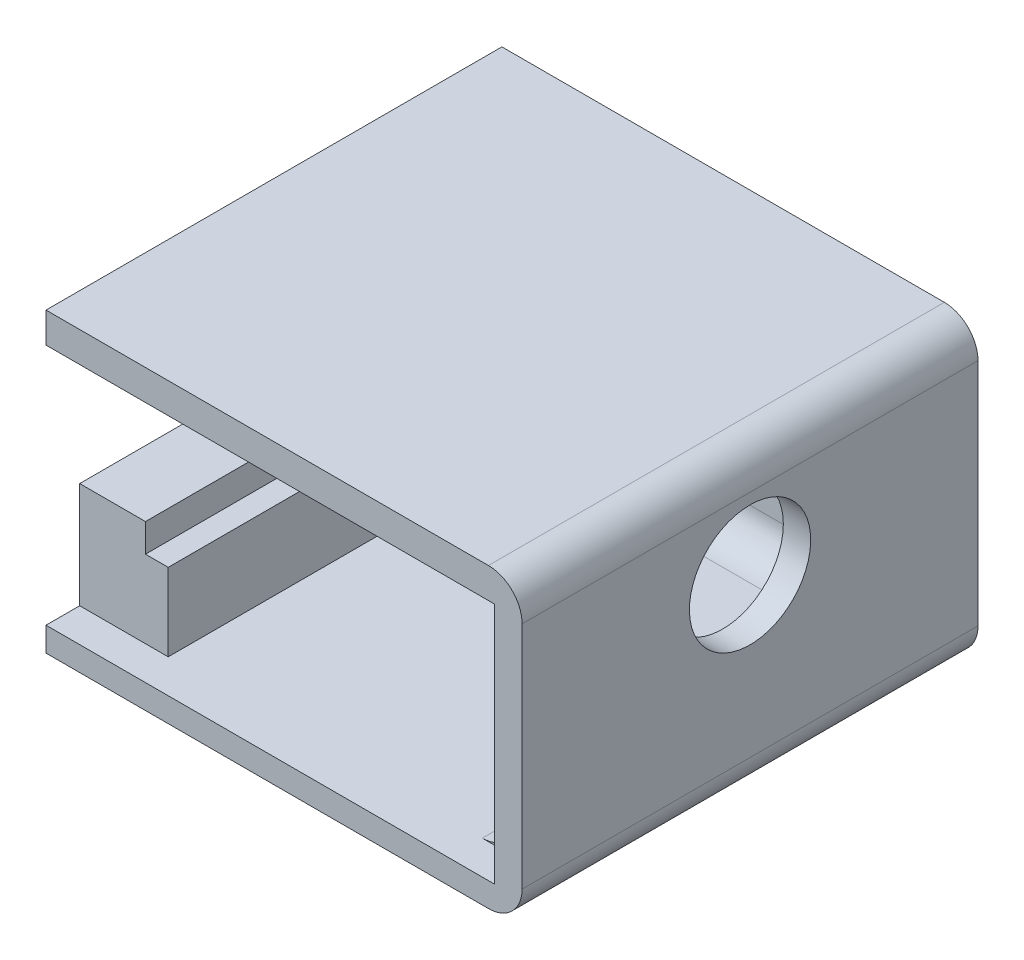
ISO-10303-21;
HEADER;
FILE_DESCRIPTION(('STEP AP214'),'2;1');
FILE_NAME('part.step','',(''),(''),'','','');
FILE_SCHEMA(('AUTOMOTIVE_DESIGN { 1 0 10303 214 1 1 1 1 }'));
ENDSEC;
DATA;
#1=APPLICATION_CONTEXT('core data for automotive mechanical design processes');
#2=APPLICATION_PROTOCOL_DEFINITION('international standard','automotive_design',2000,#1);
#3=PRODUCT_CONTEXT('',#1,'mechanical');
#4=PRODUCT('Part','Part','',(#3));
#5=PRODUCT_RELATED_PRODUCT_CATEGORY('part','',(#4));
#6=PRODUCT_DEFINITION_FORMATION('','',#4);
#7=PRODUCT_DEFINITION_CONTEXT('part definition',#1,'design');
#8=PRODUCT_DEFINITION('design','',#6,#7);
#9=PRODUCT_DEFINITION_SHAPE('','',#8);
#10=(LENGTH_UNIT() NAMED_UNIT(*) SI_UNIT(.MILLI.,.METRE.));
#11=(NAMED_UNIT(*) PLANE_ANGLE_UNIT() SI_UNIT($,.RADIAN.));
#12=(NAMED_UNIT(*) SI_UNIT($,.STERADIAN.) SOLID_ANGLE_UNIT());
#13=UNCERTAINTY_MEASURE_WITH_UNIT(LENGTH_MEASURE(1.E-05),#10,'distance_accuracy_value','');
#14=(GEOMETRIC_REPRESENTATION_CONTEXT(3) GLOBAL_UNCERTAINTY_ASSIGNED_CONTEXT((#13)) GLOBAL_UNIT_ASSIGNED_CONTEXT((#10,
#11,#12)) REPRESENTATION_CONTEXT('',''));
#15=CARTESIAN_POINT('',(0.,0.,0.));
#16=DIRECTION('',(0.,0.,1.));
#17=DIRECTION('',(1.,0.,0.));
#18=AXIS2_PLACEMENT_3D('',#15,#16,#17);
#19=CARTESIAN_POINT('',(-29.2123137237562,-14.8612171338496,-14.8829667343191));
#20=DIRECTION('',(0.,-1.,0.));
#21=DIRECTION('',(0.,0.,-1.));
#22=AXIS2_PLACEMENT_3D('',#19,#20,#21);
#23=PLANE('',#22);
#24=DIRECTION('',(1.,0.,0.));
#25=VECTOR('',#24,1.);
#26=CARTESIAN_POINT('',(-29.2123137237562,-14.8612171338496,-31.6029676477843));
#27=LINE('',#26,#25);
#28=CARTESIAN_POINT('',(-29.2123137237562,-14.8612171338496,-31.6029676477843));
#29=VERTEX_POINT('',#28);
#30=CARTESIAN_POINT('',(-26.2827516064484,-14.8612171338496,-31.6029676477843));
#31=VERTEX_POINT('',#30);
#32=EDGE_CURVE('E248',#29,#31,#27,.T.);
#33=ORIENTED_EDGE('',*,*,#32,.F.);
#34=DIRECTION('',(0.,0.,-1.));
#35=VECTOR('',#34,1.);
#36=CARTESIAN_POINT('',(-29.2123137237562,-14.8612171338496,-14.8829667343191));
#37=LINE('',#36,#35);
#38=CARTESIAN_POINT('',(-29.2123135264694,-14.8612171338496,-16.3829667343191));
#39=VERTEX_POINT('',#38);
#40=EDGE_CURVE('E357',#39,#29,#37,.T.);
#41=ORIENTED_EDGE('',*,*,#40,.F.);
#42=DIRECTION('',(-1.,0.,0.));
#43=VECTOR('',#42,1.);
#44=CARTESIAN_POINT('',(-29.2123137237562,-14.8612171338496,-16.3829667343191));
#45=LINE('',#44,#43);
#46=CARTESIAN_POINT('',(-26.2827516064484,-14.8612171338496,-16.3829667343191));
#47=VERTEX_POINT('',#46);
#48=EDGE_CURVE('E288',#47,#39,#45,.T.);
#49=ORIENTED_EDGE('',*,*,#48,.F.);
#50=DIRECTION('',(0.,0.,-1.));
#51=VECTOR('',#50,1.);
#52=CARTESIAN_POINT('',(-26.2827516064484,-14.8612171338496,-14.8829667343191));
#53=LINE('',#52,#51);
#54=EDGE_CURVE('E360',#47,#31,#53,.T.);
#55=ORIENTED_EDGE('',*,*,#54,.T.);
#56=EDGE_LOOP('',(#33,#41,#49,#55));
#57=FACE_BOUND('',#56,.T.);
#58=ADVANCED_FACE('F46',(#57),#23,.F.);
#59=CARTESIAN_POINT('',(-29.2123137237562,-8.77234834713554,-14.8829667343191));
#60=DIRECTION('',(0.,1.,0.));
#61=DIRECTION('',(0.,0.,1.));
#62=AXIS2_PLACEMENT_3D('',#59,#60,#61);
#63=PLANE('',#62);
#64=DIRECTION('',(0.,0.,-1.));
#65=VECTOR('',#64,1.);
#66=CARTESIAN_POINT('',(-23.9868864308807,-8.77234834713555,-31.6029676477843));
#67=LINE('',#66,#65);
#68=CARTESIAN_POINT('',(-23.9868864308807,-8.77234834713554,-31.6029676477843));
#69=VERTEX_POINT('',#68);
#70=CARTESIAN_POINT('',(-23.9868864308807,-8.77234834713555,-32.1829667343191));
#71=VERTEX_POINT('',#70);
#72=EDGE_CURVE('E261',#69,#71,#67,.T.);
#73=ORIENTED_EDGE('',*,*,#72,.T.);
#74=DIRECTION('',(-1.,0.,0.));
#75=VECTOR('',#74,1.);
#76=CARTESIAN_POINT('',(-15.7085447505018,-8.77234834713554,-32.1829667343191));
#77=LINE('',#76,#75);
#78=CARTESIAN_POINT('',(-15.7085447505018,-8.77234834713554,-32.1829667343191));
#79=VERTEX_POINT('',#78);
#80=EDGE_CURVE('E71',#71,#79,#77,.F.);
#81=ORIENTED_EDGE('',*,*,#80,.T.);
#82=DIRECTION('',(0.,0.,-1.));
#83=VECTOR('',#82,1.);
#84=CARTESIAN_POINT('',(-15.7085447505018,-8.77234834713554,-14.8829667343191));
#85=LINE('',#84,#83);
#86=CARTESIAN_POINT('',(-15.7085447505018,-8.77234834713556,-16.3829667343191));
#87=VERTEX_POINT('',#86);
#88=EDGE_CURVE('E381',#87,#79,#85,.T.);
#89=ORIENTED_EDGE('',*,*,#88,.F.);
#90=DIRECTION('',(-1.,0.,0.));
#91=VECTOR('',#90,1.);
#92=CARTESIAN_POINT('',(-29.2123135264694,-8.77234834713556,-16.3829667343191));
#93=LINE('',#92,#91);
#94=CARTESIAN_POINT('',(-9.23057385456345,-8.77234834713556,-16.3829667343191));
#95=VERTEX_POINT('',#94);
#96=EDGE_CURVE('E282',#95,#87,#93,.T.);
#97=ORIENTED_EDGE('',*,*,#96,.F.);
#98=DIRECTION('',(0.,0.,1.));
#99=VECTOR('',#98,1.);
#100=CARTESIAN_POINT('',(-9.23057385456345,-8.77234834713556,-16.3829667343191));
#101=LINE('',#100,#99);
#102=CARTESIAN_POINT('',(-9.23057385456345,-8.77234834713556,-14.8829667343191));
#103=VERTEX_POINT('',#102);
#104=EDGE_CURVE('E285',#95,#103,#101,.T.);
#105=ORIENTED_EDGE('',*,*,#104,.T.);
#106=DIRECTION('',(1.,0.,0.));
#107=VECTOR('',#106,1.);
#108=CARTESIAN_POINT('',(-29.2123137237562,-8.77234834713554,-14.8829667343191));
#109=LINE('',#108,#107);
#110=CARTESIAN_POINT('',(-29.2123137237562,-8.77234834713554,-14.8829667343191));
#111=VERTEX_POINT('',#110);
#112=EDGE_CURVE('E336',#111,#103,#109,.T.);
#113=ORIENTED_EDGE('',*,*,#112,.F.);
#114=DIRECTION('',(0.,0.,-1.));
#115=VECTOR('',#114,1.);
#116=CARTESIAN_POINT('',(-29.2123137237562,-8.77234834713554,-14.8829667343191));
#117=LINE('',#116,#115);
#118=CARTESIAN_POINT('',(-29.2123137237562,-8.77234834713554,-31.6029676477843));
#119=VERTEX_POINT('',#118);
#120=EDGE_CURVE('E383',#111,#119,#117,.T.);
#121=ORIENTED_EDGE('',*,*,#120,.T.);
#122=DIRECTION('',(-1.,0.,0.));
#123=VECTOR('',#122,1.);
#124=CARTESIAN_POINT('',(-29.2123137237562,-8.77234834713555,-31.6029676477843));
#125=LINE('',#124,#123);
#126=EDGE_CURVE('E264',#69,#119,#125,.T.);
#127=ORIENTED_EDGE('',*,*,#126,.F.);
#128=EDGE_LOOP('',(#73,#81,#89,#97,#105,#113,#121,#127));
#129=FACE_BOUND('',#128,.T.);
#130=ADVANCED_FACE('F529',(#129),#63,.F.);
#131=CARTESIAN_POINT('',(0.,0.,-33.6829667343191));
#132=DIRECTION('',(0.,0.,-1.));
#133=DIRECTION('',(-1.,0.,0.));
#134=AXIS2_PLACEMENT_3D('',#131,#132,#133);
#135=PLANE('',#134);
#136=DIRECTION('',(0.,1.,0.));
#137=VECTOR('',#136,1.);
#138=CARTESIAN_POINT('',(-15.7085447505018,-8.77234834713554,-33.6829667343191));
#139=LINE('',#138,#137);
#140=CARTESIAN_POINT('',(-15.7085447505018,-10.6850416503504,-33.6829667343191));
#141=VERTEX_POINT('',#140);
#142=CARTESIAN_POINT('',(-15.7085447505018,-10.2723483471355,-33.6829667343191));
#143=VERTEX_POINT('',#142);
#144=EDGE_CURVE('E319',#141,#143,#139,.T.);
#145=ORIENTED_EDGE('',*,*,#144,.T.);
#146=DIRECTION('',(-1.,0.,0.));
#147=VECTOR('',#146,1.);
#148=CARTESIAN_POINT('',(-23.9868864308807,-10.2723483471355,-33.6829667343191));
#149=LINE('',#148,#147);
#150=CARTESIAN_POINT('',(-23.9868864308807,-10.2723483471355,-33.6829667343191));
#151=VERTEX_POINT('',#150);
#152=EDGE_CURVE('E439',#143,#151,#149,.T.);
#153=ORIENTED_EDGE('',*,*,#152,.T.);
#154=DIRECTION('',(0.,1.,0.));
#155=VECTOR('',#154,1.);
#156=CARTESIAN_POINT('',(-23.9868864308807,-8.77234834713555,-33.6829667343191));
#157=LINE('',#156,#155);
#158=CARTESIAN_POINT('',(-23.9868864308807,-14.8612171338496,-33.6829667343191));
#159=VERTEX_POINT('',#158);
#160=EDGE_CURVE('E269',#159,#151,#157,.T.);
#161=ORIENTED_EDGE('',*,*,#160,.F.);
#162=DIRECTION('',(1.,0.,0.));
#163=VECTOR('',#162,1.);
#164=CARTESIAN_POINT('',(0.,-14.8612171338496,-33.6829667343191));
#165=LINE('',#164,#163);
#166=CARTESIAN_POINT('',(-26.2827516064484,-14.8612171338496,-33.6829667343191));
#167=VERTEX_POINT('',#166);
#168=EDGE_CURVE('E257',#167,#159,#165,.T.);
#169=ORIENTED_EDGE('',*,*,#168,.F.);
#170=DIRECTION('',(0.,-1.,0.));
#171=VECTOR('',#170,1.);
#172=CARTESIAN_POINT('',(-26.2827516064484,-14.8612171338496,-33.6829667343191));
#173=LINE('',#172,#171);
#174=CARTESIAN_POINT('',(-26.2827516064484,-16.1203527651684,-33.6829667343191));
#175=VERTEX_POINT('',#174);
#176=EDGE_CURVE('E310',#167,#175,#173,.T.);
#177=ORIENTED_EDGE('',*,*,#176,.T.);
#178=DIRECTION('',(1.,0.,0.));
#179=VECTOR('',#178,1.);
#180=CARTESIAN_POINT('',(-25.2701761684877,-16.1203527651684,-33.6829667343191));
#181=LINE('',#180,#179);
#182=CARTESIAN_POINT('',(-25.2701761684877,-16.1203527651684,-33.6829667343191));
#183=VERTEX_POINT('',#182);
#184=EDGE_CURVE('E313',#175,#183,#181,.T.);
#185=ORIENTED_EDGE('',*,*,#184,.T.);
#186=DIRECTION('',(0.,-1.,0.));
#187=VECTOR('',#186,1.);
#188=CARTESIAN_POINT('',(-25.2701761684877,-16.1203527651684,-33.6829667343191));
#189=LINE('',#188,#187);
#190=CARTESIAN_POINT('',(-25.2701761684877,-18.0725158209321,-33.6829667343191));
#191=VERTEX_POINT('',#190);
#192=EDGE_CURVE('E316',#183,#191,#189,.T.);
#193=ORIENTED_EDGE('',*,*,#192,.T.);
#194=DIRECTION('',(1.,0.,0.));
#195=VECTOR('',#194,1.);
#196=CARTESIAN_POINT('',(-11.2860781579052,-18.0725158209321,-33.6829667343191));
#197=LINE('',#196,#195);
#198=CARTESIAN_POINT('',(-11.2860781579052,-18.0725158209321,-33.6829667343191));
#199=VERTEX_POINT('',#198);
#200=EDGE_CURVE('E431',#191,#199,#197,.T.);
#201=ORIENTED_EDGE('',*,*,#200,.T.);
#202=DIRECTION('',(0.,-1.,0.));
#203=VECTOR('',#202,1.);
#204=CARTESIAN_POINT('',(-11.2860781579052,-17.6477380882893,-33.6829667343191));
#205=LINE('',#204,#203);
#206=CARTESIAN_POINT('',(-11.2860781579052,-17.6477380882893,-33.6829667343191));
#207=VERTEX_POINT('',#206);
#208=EDGE_CURVE('E433',#199,#207,#205,.F.);
#209=ORIENTED_EDGE('',*,*,#208,.T.);
#210=DIRECTION('',(1.,0.,0.));
#211=VECTOR('',#210,1.);
#212=CARTESIAN_POINT('',(-9.23057405185025,-17.6477380882893,-33.6829667343191));
#213=LINE('',#212,#211);
#214=CARTESIAN_POINT('',(-10.7305740518503,-17.6477380882893,-33.6829667343191));
#215=VERTEX_POINT('',#214);
#216=EDGE_CURVE('E436',#207,#215,#213,.T.);
#217=ORIENTED_EDGE('',*,*,#216,.T.);
#218=DIRECTION('',(0.,1.,0.));
#219=VECTOR('',#218,1.);
#220=CARTESIAN_POINT('',(-10.7305740518503,-9.18504165035041,-33.6829667343191));
#221=LINE('',#220,#219);
#222=CARTESIAN_POINT('',(-10.7305740518503,-10.6850416503504,-33.6829667343191));
#223=VERTEX_POINT('',#222);
#224=EDGE_CURVE('E414',#215,#223,#221,.T.);
#225=ORIENTED_EDGE('',*,*,#224,.T.);
#226=DIRECTION('',(-1.,0.,0.));
#227=VECTOR('',#226,1.);
#228=CARTESIAN_POINT('',(-15.7085447505018,-10.6850416503504,-33.6829667343191));
#229=LINE('',#228,#227);
#230=EDGE_CURVE('E411',#223,#141,#229,.T.);
#231=ORIENTED_EDGE('',*,*,#230,.T.);
#232=EDGE_LOOP('',(#145,#153,#161,#169,#177,#185,#193,#201,#209,#217,#225,#231));
#233=FACE_BOUND('',#232,.T.);
#234=ADVANCED_FACE('F467',(#233),#135,.F.);
#235=CARTESIAN_POINT('',(-15.7085447505018,-8.77234834713554,-14.8829667343191));
#236=DIRECTION('',(1.,0.,0.));
#237=DIRECTION('',(0.,0.,-1.));
#238=AXIS2_PLACEMENT_3D('',#235,#236,#237);
#239=PLANE('',#238);
#240=ORIENTED_EDGE('',*,*,#88,.T.);
#241=CARTESIAN_POINT('',(-15.7085447505018,-10.2723483471355,-32.1829667343191));
#242=DIRECTION('',(1.,0.,0.));
#243=DIRECTION('',(0.,0.,-1.));
#244=AXIS2_PLACEMENT_3D('',#241,#242,#243);
#245=CIRCLE('',#244,1.5);
#246=EDGE_CURVE('E447',#79,#143,#245,.F.);
#247=ORIENTED_EDGE('',*,*,#246,.T.);
#248=ORIENTED_EDGE('',*,*,#144,.F.);
#249=CARTESIAN_POINT('',(-15.7085447505018,-10.6850416503504,-32.1829667343191));
#250=DIRECTION('',(1.,0.,0.));
#251=DIRECTION('',(0.,0.,-1.));
#252=AXIS2_PLACEMENT_3D('',#249,#250,#251);
#253=CIRCLE('',#252,1.5);
#254=CARTESIAN_POINT('',(-15.7085447505018,-9.18504165035041,-32.1829667343191));
#255=VERTEX_POINT('',#254);
#256=EDGE_CURVE('E422',#141,#255,#253,.T.);
#257=ORIENTED_EDGE('',*,*,#256,.T.);
#258=DIRECTION('',(0.,0.,-1.));
#259=VECTOR('',#258,1.);
#260=CARTESIAN_POINT('',(-15.7085447505018,-9.18504165035041,-14.8829667343191));
#261=LINE('',#260,#259);
#262=CARTESIAN_POINT('',(-15.7085447505019,-9.18504165035041,-16.3829667343191));
#263=VERTEX_POINT('',#262);
#264=EDGE_CURVE('E378',#263,#255,#261,.T.);
#265=ORIENTED_EDGE('',*,*,#264,.F.);
#266=DIRECTION('',(0.,-1.,0.));
#267=VECTOR('',#266,1.);
#268=CARTESIAN_POINT('',(-15.7085447505018,-8.77234834713554,-16.3829667343191));
#269=LINE('',#268,#267);
#270=EDGE_CURVE('E308',#87,#263,#269,.T.);
#271=ORIENTED_EDGE('',*,*,#270,.F.);
#272=EDGE_LOOP('',(#240,#247,#248,#257,#265,#271));
#273=FACE_BOUND('',#272,.T.);
#274=ADVANCED_FACE('F561',(#273),#239,.F.);
#275=CARTESIAN_POINT('',(-9.23057405185025,-9.18504165035041,-14.8829667343191));
#276=DIRECTION('',(0.,1.,0.));
#277=DIRECTION('',(0.,0.,1.));
#278=AXIS2_PLACEMENT_3D('',#275,#276,#277);
#279=PLANE('',#278);
#280=ORIENTED_EDGE('',*,*,#264,.T.);
#281=DIRECTION('',(-1.,0.,0.));
#282=VECTOR('',#281,1.);
#283=CARTESIAN_POINT('',(-9.23057405185025,-9.18504165035041,-32.1829667343191));
#284=LINE('',#283,#282);
#285=CARTESIAN_POINT('',(-9.23057405185025,-9.18504165035041,-32.1829667343191));
#286=VERTEX_POINT('',#285);
#287=EDGE_CURVE('E420',#255,#286,#284,.F.);
#288=ORIENTED_EDGE('',*,*,#287,.T.);
#289=DIRECTION('',(0.,0.,-1.));
#290=VECTOR('',#289,1.);
#291=CARTESIAN_POINT('',(-9.23057405185025,-9.18504165035041,-14.8829667343191));
#292=LINE('',#291,#290);
#293=CARTESIAN_POINT('',(-9.23057385456345,-9.18504165035041,-16.3829667343191));
#294=VERTEX_POINT('',#293);
#295=EDGE_CURVE('E375',#294,#286,#292,.T.);
#296=ORIENTED_EDGE('',*,*,#295,.F.);
#297=DIRECTION('',(1.,0.,0.));
#298=VECTOR('',#297,1.);
#299=CARTESIAN_POINT('',(-9.23057405185025,-9.18504165035041,-16.3829667343191));
#300=LINE('',#299,#298);
#301=EDGE_CURVE('E306',#263,#294,#300,.T.);
#302=ORIENTED_EDGE('',*,*,#301,.F.);
#303=EDGE_LOOP('',(#280,#288,#296,#302));
#304=FACE_BOUND('',#303,.T.);
#305=ADVANCED_FACE('F555',(#304),#279,.F.);
#306=CARTESIAN_POINT('',(-9.23057405185025,-17.6477380882893,-14.8829667343191));
#307=DIRECTION('',(0.,-1.,0.));
#308=DIRECTION('',(0.,0.,-1.));
#309=AXIS2_PLACEMENT_3D('',#306,#307,#308);
#310=PLANE('',#309);
#311=DIRECTION('',(0.,0.,-1.));
#312=VECTOR('',#311,1.);
#313=CARTESIAN_POINT('',(-9.23057405185025,-17.6477380882893,-14.8829667343191));
#314=LINE('',#313,#312);
#315=CARTESIAN_POINT('',(-9.23057385456345,-17.6477380882893,-16.3829667343191));
#316=VERTEX_POINT('',#315);
#317=CARTESIAN_POINT('',(-9.23057405185025,-17.6477380882893,-32.1829667343191));
#318=VERTEX_POINT('',#317);
#319=EDGE_CURVE('E372',#316,#318,#314,.T.);
#320=ORIENTED_EDGE('',*,*,#319,.T.);
#321=CARTESIAN_POINT('',(-10.7305740518503,-17.6477380882893,-32.1829667343191));
#322=DIRECTION('',(0.,-1.,0.));
#323=DIRECTION('',(0.,0.,-1.));
#324=AXIS2_PLACEMENT_3D('',#321,#322,#323);
#325=CIRCLE('',#324,1.5);
#326=EDGE_CURVE('E418',#318,#215,#325,.F.);
#327=ORIENTED_EDGE('',*,*,#326,.T.);
#328=ORIENTED_EDGE('',*,*,#216,.F.);
#329=CARTESIAN_POINT('',(-11.2860781579052,-17.6477380882893,-32.1829667343191));
#330=DIRECTION('',(0.,-1.,0.));
#331=DIRECTION('',(0.,0.,-1.));
#332=AXIS2_PLACEMENT_3D('',#329,#330,#331);
#333=CIRCLE('',#332,1.5);
#334=CARTESIAN_POINT('',(-9.78607815790524,-17.6477380882893,-32.1829667343191));
#335=VERTEX_POINT('',#334);
#336=EDGE_CURVE('E11',#207,#335,#333,.T.);
#337=ORIENTED_EDGE('',*,*,#336,.T.);
#338=DIRECTION('',(0.,0.,-1.));
#339=VECTOR('',#338,1.);
#340=CARTESIAN_POINT('',(-9.78607815790524,-17.6477380882893,-14.8829667343191));
#341=LINE('',#340,#339);
#342=CARTESIAN_POINT('',(-9.78607815790524,-17.6477380882893,-16.3829667343191));
#343=VERTEX_POINT('',#342);
#344=EDGE_CURVE('E369',#343,#335,#341,.T.);
#345=ORIENTED_EDGE('',*,*,#344,.F.);
#346=DIRECTION('',(-1.,0.,0.));
#347=VECTOR('',#346,1.);
#348=CARTESIAN_POINT('',(-9.23057405185025,-17.6477380882893,-16.3829667343191));
#349=LINE('',#348,#347);
#350=EDGE_CURVE('E304',#316,#343,#349,.T.);
#351=ORIENTED_EDGE('',*,*,#350,.F.);
#352=EDGE_LOOP('',(#320,#327,#328,#337,#345,#351));
#353=FACE_BOUND('',#352,.T.);
#354=ADVANCED_FACE('F503',(#353),#310,.F.);
#355=CARTESIAN_POINT('',(-9.78607815790524,-17.6477380882893,-14.8829667343191));
#356=DIRECTION('',(1.,0.,0.));
#357=DIRECTION('',(0.,0.,-1.));
#358=AXIS2_PLACEMENT_3D('',#355,#356,#357);
#359=PLANE('',#358);
#360=ORIENTED_EDGE('',*,*,#344,.T.);
#361=DIRECTION('',(0.,-1.,0.));
#362=VECTOR('',#361,1.);
#363=CARTESIAN_POINT('',(-9.78607815790524,-18.0725158209321,-32.1829667343191));
#364=LINE('',#363,#362);
#365=CARTESIAN_POINT('',(-9.78607815790524,-18.0725158209321,-32.1829667343191));
#366=VERTEX_POINT('',#365);
#367=EDGE_CURVE('E424',#335,#366,#364,.T.);
#368=ORIENTED_EDGE('',*,*,#367,.T.);
#369=DIRECTION('',(0.,0.,-1.));
#370=VECTOR('',#369,1.);
#371=CARTESIAN_POINT('',(-9.78607815790524,-18.0725158209321,-16.3829667343191));
#372=LINE('',#371,#370);
#373=CARTESIAN_POINT('',(-9.78607815790524,-18.0725158209321,-16.3829667343191));
#374=VERTEX_POINT('',#373);
#375=EDGE_CURVE('E388',#366,#374,#372,.F.);
#376=ORIENTED_EDGE('',*,*,#375,.T.);
#377=DIRECTION('',(0.,-1.,0.));
#378=VECTOR('',#377,1.);
#379=CARTESIAN_POINT('',(-9.78607815790524,-17.6477380882893,-16.3829667343191));
#380=LINE('',#379,#378);
#381=EDGE_CURVE('E301',#343,#374,#380,.T.);
#382=ORIENTED_EDGE('',*,*,#381,.F.);
#383=EDGE_LOOP('',(#360,#368,#376,#382));
#384=FACE_BOUND('',#383,.T.);
#385=ADVANCED_FACE('F506',(#384),#359,.F.);
#386=CARTESIAN_POINT('',(-25.2701761684877,-16.1203527651684,-14.8829667343191));
#387=DIRECTION('',(-1.,0.,0.));
#388=DIRECTION('',(0.,0.,1.));
#389=AXIS2_PLACEMENT_3D('',#386,#387,#388);
#390=PLANE('',#389);
#391=DIRECTION('',(0.,0.,-1.));
#392=VECTOR('',#391,1.);
#393=CARTESIAN_POINT('',(-25.2701761684877,-19.5725158209321,-14.8829667343191));
#394=LINE('',#393,#392);
#395=CARTESIAN_POINT('',(-25.2701761684877,-19.5725158209321,-16.3829667343191));
#396=VERTEX_POINT('',#395);
#397=CARTESIAN_POINT('',(-25.2701761684877,-19.5725158209321,-32.1829667343191));
#398=VERTEX_POINT('',#397);
#399=EDGE_CURVE('E367',#396,#398,#394,.T.);
#400=ORIENTED_EDGE('',*,*,#399,.T.);
#401=CARTESIAN_POINT('',(-25.2701761684877,-18.0725158209321,-32.1829667343191));
#402=DIRECTION('',(-1.,0.,0.));
#403=DIRECTION('',(0.,0.,1.));
#404=AXIS2_PLACEMENT_3D('',#401,#402,#403);
#405=CIRCLE('',#404,1.5);
#406=EDGE_CURVE('E55',#398,#191,#405,.F.);
#407=ORIENTED_EDGE('',*,*,#406,.T.);
#408=ORIENTED_EDGE('',*,*,#192,.F.);
#409=DIRECTION('',(0.,0.,-1.));
#410=VECTOR('',#409,1.);
#411=CARTESIAN_POINT('',(-25.2701761684877,-16.1203527651684,-14.8829667343191));
#412=LINE('',#411,#410);
#413=CARTESIAN_POINT('',(-25.2701761684877,-16.1203527651684,-16.3829667343191));
#414=VERTEX_POINT('',#413);
#415=EDGE_CURVE('E365',#414,#183,#412,.T.);
#416=ORIENTED_EDGE('',*,*,#415,.F.);
#417=DIRECTION('',(0.,1.,0.));
#418=VECTOR('',#417,1.);
#419=CARTESIAN_POINT('',(-25.2701761684877,-16.1203527651684,-16.3829667343191));
#420=LINE('',#419,#418);
#421=EDGE_CURVE('E299',#396,#414,#420,.T.);
#422=ORIENTED_EDGE('',*,*,#421,.F.);
#423=EDGE_LOOP('',(#400,#407,#408,#416,#422));
#424=FACE_BOUND('',#423,.T.);
#425=ADVANCED_FACE('F473',(#424),#390,.F.);
#426=CARTESIAN_POINT('',(-25.2701761684877,-16.1203527651684,-14.8829667343191));
#427=DIRECTION('',(0.,-1.,0.));
#428=DIRECTION('',(0.,0.,-1.));
#429=AXIS2_PLACEMENT_3D('',#426,#427,#428);
#430=PLANE('',#429);
#431=DIRECTION('',(-1.,0.,0.));
#432=VECTOR('',#431,1.);
#433=CARTESIAN_POINT('',(-25.2701761684877,-16.1203527651684,-16.3829667343191));
#434=LINE('',#433,#432);
#435=CARTESIAN_POINT('',(-26.2827516064484,-16.1203527651684,-16.3829667343191));
#436=VERTEX_POINT('',#435);
#437=EDGE_CURVE('E297',#414,#436,#434,.T.);
#438=ORIENTED_EDGE('',*,*,#437,.F.);
#439=ORIENTED_EDGE('',*,*,#415,.T.);
#440=ORIENTED_EDGE('',*,*,#184,.F.);
#441=DIRECTION('',(0.,0.,-1.));
#442=VECTOR('',#441,1.);
#443=CARTESIAN_POINT('',(-26.2827516064484,-16.1203527651684,-14.8829667343191));
#444=LINE('',#443,#442);
#445=EDGE_CURVE('E363',#436,#175,#444,.T.);
#446=ORIENTED_EDGE('',*,*,#445,.F.);
#447=EDGE_LOOP('',(#438,#439,#440,#446));
#448=FACE_BOUND('',#447,.T.);
#449=ADVANCED_FACE('F542',(#448),#430,.F.);
#450=CARTESIAN_POINT('',(-26.2827516064484,-14.8612171338496,-14.8829667343191));
#451=DIRECTION('',(-1.,0.,0.));
#452=DIRECTION('',(0.,0.,1.));
#453=AXIS2_PLACEMENT_3D('',#450,#451,#452);
#454=PLANE('',#453);
#455=DIRECTION('',(0.,1.,0.));
#456=VECTOR('',#455,1.);
#457=CARTESIAN_POINT('',(-26.2827516064484,-14.8612171338496,-16.3829667343191));
#458=LINE('',#457,#456);
#459=EDGE_CURVE('E295',#436,#47,#458,.T.);
#460=ORIENTED_EDGE('',*,*,#459,.F.);
#461=ORIENTED_EDGE('',*,*,#445,.T.);
#462=ORIENTED_EDGE('',*,*,#176,.F.);
#463=DIRECTION('',(0.,0.,-1.));
#464=VECTOR('',#463,1.);
#465=CARTESIAN_POINT('',(-26.2827516064484,-14.8612171338496,-14.8829667343191));
#466=LINE('',#465,#464);
#467=EDGE_CURVE('E260',#31,#167,#466,.T.);
#468=ORIENTED_EDGE('',*,*,#467,.F.);
#469=ORIENTED_EDGE('',*,*,#54,.F.);
#470=EDGE_LOOP('',(#460,#461,#462,#468,#469));
#471=FACE_BOUND('',#470,.T.);
#472=ADVANCED_FACE('F539',(#471),#454,.F.);
#473=CARTESIAN_POINT('',(-9.23057405185025,-17.4004311571611,-14.8829667343191));
#474=DIRECTION('',(1.,0.,0.));
#475=DIRECTION('',(0.,0.,-1.));
#476=AXIS2_PLACEMENT_3D('',#473,#474,#475);
#477=PLANE('',#476);
#478=CARTESIAN_POINT('',(-9.23057405185025,-12.1074186089233,-25.0329667343191));
#479=DIRECTION('',(1.,0.,0.));
#480=DIRECTION('',(0.,0.,-1.));
#481=AXIS2_PLACEMENT_3D('',#478,#479,#480);
#482=CIRCLE('',#481,2.7);
#483=CARTESIAN_POINT('',(-9.23057405185025,-12.1074186089233,-27.7329667343191));
#484=VERTEX_POINT('',#483);
#485=EDGE_CURVE('E271',#484,#484,#482,.F.);
#486=ORIENTED_EDGE('',*,*,#485,.F.);
#487=EDGE_LOOP('',(#486));
#488=FACE_BOUND('',#487,.T.);
#489=ORIENTED_EDGE('',*,*,#295,.T.);
#490=DIRECTION('',(0.,1.,0.));
#491=VECTOR('',#490,1.);
#492=CARTESIAN_POINT('',(-9.23057405185025,-17.6477380882893,-32.1829667343191));
#493=LINE('',#492,#491);
#494=EDGE_CURVE('E416',#286,#318,#493,.F.);
#495=ORIENTED_EDGE('',*,*,#494,.T.);
#496=ORIENTED_EDGE('',*,*,#319,.F.);
#497=DIRECTION('',(0.,1.,0.));
#498=VECTOR('',#497,1.);
#499=CARTESIAN_POINT('',(-9.23057385456345,-8.77234834713556,-16.3829667343191));
#500=LINE('',#499,#498);
#501=CARTESIAN_POINT('',(-9.23057385456345,-19.5725158209321,-16.3829667343191));
#502=VERTEX_POINT('',#501);
#503=EDGE_CURVE('E280',#502,#316,#500,.T.);
#504=ORIENTED_EDGE('',*,*,#503,.F.);
#505=DIRECTION('',(0.,0.,1.));
#506=VECTOR('',#505,1.);
#507=CARTESIAN_POINT('',(-9.23057385456345,-19.5725158209321,-16.3829667343191));
#508=LINE('',#507,#506);
#509=CARTESIAN_POINT('',(-9.23057385456345,-19.5725158209321,-14.8829667343191));
#510=VERTEX_POINT('',#509);
#511=EDGE_CURVE('E289',#502,#510,#508,.T.);
#512=ORIENTED_EDGE('',*,*,#511,.T.);
#513=DIRECTION('',(0.,-1.,0.));
#514=VECTOR('',#513,1.);
#515=CARTESIAN_POINT('',(-9.23057405185025,-15.7089918171611,-14.8829667343191));
#516=LINE('',#515,#514);
#517=EDGE_CURVE('E338',#103,#510,#516,.T.);
#518=ORIENTED_EDGE('',*,*,#517,.F.);
#519=ORIENTED_EDGE('',*,*,#104,.F.);
#520=EDGE_CURVE('E279',#294,#95,#500,.T.);
#521=ORIENTED_EDGE('',*,*,#520,.F.);
#522=EDGE_LOOP('',(#489,#495,#496,#504,#512,#518,#519,#521));
#523=FACE_BOUND('',#522,.T.);
#524=ADVANCED_FACE('F494',(#488,#523),#477,.F.);
#525=CARTESIAN_POINT('',(-24.4209057708305,-19.5725158209321,-14.8829667343191));
#526=DIRECTION('',(0.,-1.,0.));
#527=DIRECTION('',(0.,0.,-1.));
#528=AXIS2_PLACEMENT_3D('',#525,#526,#527);
#529=PLANE('',#528);
#530=DIRECTION('',(0.,0.,-1.));
#531=VECTOR('',#530,1.);
#532=CARTESIAN_POINT('',(-11.2860781579052,-19.5725158209321,-33.6829667343191));
#533=LINE('',#532,#531);
#534=CARTESIAN_POINT('',(-11.2860781579052,-19.5725158209321,-16.3829667343191));
#535=VERTEX_POINT('',#534);
#536=CARTESIAN_POINT('',(-11.2860781579052,-19.5725158209321,-32.1829667343191));
#537=VERTEX_POINT('',#536);
#538=EDGE_CURVE('E386',#535,#537,#533,.T.);
#539=ORIENTED_EDGE('',*,*,#538,.T.);
#540=DIRECTION('',(1.,0.,0.));
#541=VECTOR('',#540,1.);
#542=CARTESIAN_POINT('',(-25.2701761684877,-19.5725158209321,-32.1829667343191));
#543=LINE('',#542,#541);
#544=EDGE_CURVE('E63',#537,#398,#543,.F.);
#545=ORIENTED_EDGE('',*,*,#544,.T.);
#546=ORIENTED_EDGE('',*,*,#399,.F.);
#547=DIRECTION('',(1.,0.,0.));
#548=VECTOR('',#547,1.);
#549=CARTESIAN_POINT('',(-29.2123135264694,-19.5725158209321,-16.3829667343191));
#550=LINE('',#549,#548);
#551=CARTESIAN_POINT('',(-29.2123135264694,-19.5725158209321,-16.3829667343191));
#552=VERTEX_POINT('',#551);
#553=EDGE_CURVE('E277',#552,#396,#550,.T.);
#554=ORIENTED_EDGE('',*,*,#553,.F.);
#555=DIRECTION('',(0.,0.,1.));
#556=VECTOR('',#555,1.);
#557=CARTESIAN_POINT('',(-29.2123135264694,-19.5725158209321,-16.3829667343191));
#558=LINE('',#557,#556);
#559=CARTESIAN_POINT('',(-29.2123137237562,-19.5725158209321,-14.8829667343191));
#560=VERTEX_POINT('',#559);
#561=EDGE_CURVE('E284',#552,#560,#558,.T.);
#562=ORIENTED_EDGE('',*,*,#561,.T.);
#563=DIRECTION('',(-1.,0.,0.));
#564=VECTOR('',#563,1.);
#565=CARTESIAN_POINT('',(-14.8037212227104,-19.5725158209321,-14.8829667343191));
#566=LINE('',#565,#564);
#567=EDGE_CURVE('E340',#510,#560,#566,.T.);
#568=ORIENTED_EDGE('',*,*,#567,.F.);
#569=ORIENTED_EDGE('',*,*,#511,.F.);
#570=EDGE_CURVE('E276',#535,#502,#550,.T.);
#571=ORIENTED_EDGE('',*,*,#570,.F.);
#572=EDGE_LOOP('',(#539,#545,#546,#554,#562,#568,#569,#571));
#573=FACE_BOUND('',#572,.T.);
#574=ADVANCED_FACE('F476',(#573),#529,.F.);
#575=CARTESIAN_POINT('',(-29.2123137237562,-20.6504303339754,-14.8829667343191));
#576=DIRECTION('',(1.,0.,0.));
#577=DIRECTION('',(0.,0.,-1.));
#578=AXIS2_PLACEMENT_3D('',#575,#576,#577);
#579=PLANE('',#578);
#580=DIRECTION('',(0.,-1.,0.));
#581=VECTOR('',#580,1.);
#582=CARTESIAN_POINT('',(-29.2123137237562,-20.6504303339754,-14.8829667343191));
#583=LINE('',#582,#581);
#584=CARTESIAN_POINT('',(-29.2123137237562,-20.6504303339754,-14.8829667343191));
#585=VERTEX_POINT('',#584);
#586=EDGE_CURVE('E342',#560,#585,#583,.T.);
#587=ORIENTED_EDGE('',*,*,#586,.F.);
#588=ORIENTED_EDGE('',*,*,#561,.F.);
#589=DIRECTION('',(0.,-1.,0.));
#590=VECTOR('',#589,1.);
#591=CARTESIAN_POINT('',(-29.2123135264694,-8.77234834713556,-16.3829667343191));
#592=LINE('',#591,#590);
#593=EDGE_CURVE('E274',#39,#552,#592,.T.);
#594=ORIENTED_EDGE('',*,*,#593,.F.);
#595=ORIENTED_EDGE('',*,*,#40,.T.);
#596=DIRECTION('',(0.,-1.,0.));
#597=VECTOR('',#596,1.);
#598=CARTESIAN_POINT('',(-29.2123137237562,-14.8612171338496,-31.6029676477843));
#599=LINE('',#598,#597);
#600=EDGE_CURVE('E251',#119,#29,#599,.T.);
#601=ORIENTED_EDGE('',*,*,#600,.F.);
#602=ORIENTED_EDGE('',*,*,#120,.F.);
#603=DIRECTION('',(0.,-1.,0.));
#604=VECTOR('',#603,1.);
#605=CARTESIAN_POINT('',(-29.2123137237562,-8.77234834713554,-14.8829667343191));
#606=LINE('',#605,#604);
#607=CARTESIAN_POINT('',(-29.2123137237562,-7.420991725931,-14.8829667343191));
#608=VERTEX_POINT('',#607);
#609=EDGE_CURVE('E333',#608,#111,#606,.T.);
#610=ORIENTED_EDGE('',*,*,#609,.F.);
#611=DIRECTION('',(0.,0.,-1.));
#612=VECTOR('',#611,1.);
#613=CARTESIAN_POINT('',(-29.2123137237562,-7.420991725931,-14.8829667343191));
#614=LINE('',#613,#612);
#615=CARTESIAN_POINT('',(-29.2123137237562,-7.420991725931,-35.1829667343191));
#616=VERTEX_POINT('',#615);
#617=EDGE_CURVE('E352',#608,#616,#614,.T.);
#618=ORIENTED_EDGE('',*,*,#617,.T.);
#619=DIRECTION('',(0.,-1.,0.));
#620=VECTOR('',#619,1.);
#621=CARTESIAN_POINT('',(-29.2123137237562,-8.77234834713554,-35.1829667343191));
#622=LINE('',#621,#620);
#623=CARTESIAN_POINT('',(-29.2123137237562,-20.6504303339754,-35.1829667343191));
#624=VERTEX_POINT('',#623);
#625=EDGE_CURVE('E322',#616,#624,#622,.T.);
#626=ORIENTED_EDGE('',*,*,#625,.T.);
#627=DIRECTION('',(0.,0.,-1.));
#628=VECTOR('',#627,1.);
#629=CARTESIAN_POINT('',(-29.2123137237562,-20.6504303339754,-14.8829667343191));
#630=LINE('',#629,#628);
#631=EDGE_CURVE('E355',#585,#624,#630,.T.);
#632=ORIENTED_EDGE('',*,*,#631,.F.);
#633=EDGE_LOOP('',(#587,#588,#594,#595,#601,#602,#610,#618,#626,#632));
#634=FACE_BOUND('',#633,.T.);
#635=ADVANCED_FACE('F483',(#634),#579,.F.);
#636=CARTESIAN_POINT('',(-8.01231335782909,-20.6504303339754,-14.8829667343191));
#637=DIRECTION('',(0.,1.,0.));
#638=DIRECTION('',(-1.,0.,0.));
#639=AXIS2_PLACEMENT_3D('',#636,#637,#638);
#640=PLANE('',#639);
#641=DIRECTION('',(1.,0.,0.));
#642=VECTOR('',#641,1.);
#643=CARTESIAN_POINT('',(-8.01231335782909,-20.6504303339754,-35.1829667343191));
#644=LINE('',#643,#642);
#645=CARTESIAN_POINT('',(-9.51231335782909,-20.6504303339754,-35.1829667343191));
#646=VERTEX_POINT('',#645);
#647=EDGE_CURVE('E325',#624,#646,#644,.T.);
#648=ORIENTED_EDGE('',*,*,#647,.T.);
#649=DIRECTION('',(0.,0.,-1.));
#650=VECTOR('',#649,1.);
#651=CARTESIAN_POINT('',(-9.51231335782909,-20.6504303339754,-14.8829667343191));
#652=LINE('',#651,#650);
#653=CARTESIAN_POINT('',(-9.51231335782909,-20.6504303339754,-14.8829667343191));
#654=VERTEX_POINT('',#653);
#655=EDGE_CURVE('E402',#646,#654,#652,.F.);
#656=ORIENTED_EDGE('',*,*,#655,.T.);
#657=DIRECTION('',(1.,0.,0.));
#658=VECTOR('',#657,1.);
#659=CARTESIAN_POINT('',(-8.01231335782909,-20.6504303339754,-14.8829667343191));
#660=LINE('',#659,#658);
#661=EDGE_CURVE('E344',#585,#654,#660,.T.);
#662=ORIENTED_EDGE('',*,*,#661,.F.);
#663=ORIENTED_EDGE('',*,*,#631,.T.);
#664=EDGE_LOOP('',(#648,#656,#662,#663));
#665=FACE_BOUND('',#664,.T.);
#666=ADVANCED_FACE('F589',(#665),#640,.F.);
#667=CARTESIAN_POINT('',(-8.0123133578291,-7.420991725931,-14.8829667343191));
#668=DIRECTION('',(-1.,0.,0.));
#669=DIRECTION('',(0.,-1.,0.));
#670=AXIS2_PLACEMENT_3D('',#667,#668,#669);
#671=PLANE('',#670);
#672=CARTESIAN_POINT('',(-8.0123133578291,-12.1074186089233,-25.0329667343191));
#673=DIRECTION('',(1.,0.,0.));
#674=DIRECTION('',(0.,1.,0.));
#675=AXIS2_PLACEMENT_3D('',#672,#673,#674);
#676=CIRCLE('',#675,2.7);
#677=CARTESIAN_POINT('',(-8.0123133578291,-9.40741860892329,-25.0329667343191));
#678=VERTEX_POINT('',#677);
#679=EDGE_CURVE('E428',#678,#678,#676,.T.);
#680=ORIENTED_EDGE('',*,*,#679,.F.);
#681=EDGE_LOOP('',(#680));
#682=FACE_BOUND('',#681,.T.);
#683=DIRECTION('',(0.,1.,0.));
#684=VECTOR('',#683,1.);
#685=CARTESIAN_POINT('',(-8.01231335782909,-19.6481079557216,-14.8829667343191));
#686=LINE('',#685,#684);
#687=CARTESIAN_POINT('',(-8.01231335782909,-19.1504303339754,-14.8829667343191));
#688=VERTEX_POINT('',#687);
#689=CARTESIAN_POINT('',(-8.01231335782909,-8.920991725931,-14.8829667343191));
#690=VERTEX_POINT('',#689);
#691=EDGE_CURVE('E347',#688,#690,#686,.T.);
#692=ORIENTED_EDGE('',*,*,#691,.F.);
#693=DIRECTION('',(0.,0.,-1.));
#694=VECTOR('',#693,1.);
#695=CARTESIAN_POINT('',(-8.01231335782909,-19.1504303339754,-14.8829667343191));
#696=LINE('',#695,#694);
#697=CARTESIAN_POINT('',(-8.01231335782909,-19.1504303339754,-35.1829667343191));
#698=VERTEX_POINT('',#697);
#699=EDGE_CURVE('E395',#688,#698,#696,.T.);
#700=ORIENTED_EDGE('',*,*,#699,.T.);
#701=DIRECTION('',(0.,1.,0.));
#702=VECTOR('',#701,1.);
#703=CARTESIAN_POINT('',(-8.01231335782909,-19.6481079557216,-35.1829667343191));
#704=LINE('',#703,#702);
#705=CARTESIAN_POINT('',(-8.01231335782909,-8.920991725931,-35.1829667343191));
#706=VERTEX_POINT('',#705);
#707=EDGE_CURVE('E328',#698,#706,#704,.T.);
#708=ORIENTED_EDGE('',*,*,#707,.T.);
#709=DIRECTION('',(0.,0.,-1.));
#710=VECTOR('',#709,1.);
#711=CARTESIAN_POINT('',(-8.0123133578291,-8.920991725931,-14.8829667343191));
#712=LINE('',#711,#710);
#713=EDGE_CURVE('E393',#706,#690,#712,.F.);
#714=ORIENTED_EDGE('',*,*,#713,.T.);
#715=EDGE_LOOP('',(#692,#700,#708,#714));
#716=FACE_BOUND('',#715,.T.);
#717=ADVANCED_FACE('F585',(#682,#716),#671,.F.);
#718=CARTESIAN_POINT('',(-29.2123137237562,-7.420991725931,-14.8829667343191));
#719=DIRECTION('',(0.,-1.,0.));
#720=DIRECTION('',(0.,0.,-1.));
#721=AXIS2_PLACEMENT_3D('',#718,#719,#720);
#722=PLANE('',#721);
#723=DIRECTION('',(-1.,0.,0.));
#724=VECTOR('',#723,1.);
#725=CARTESIAN_POINT('',(-9.51230942717903,-7.420991725931,-14.8829667343191));
#726=LINE('',#725,#724);
#727=CARTESIAN_POINT('',(-9.51231335782909,-7.420991725931,-14.8829667343191));
#728=VERTEX_POINT('',#727);
#729=EDGE_CURVE('E350',#728,#608,#726,.T.);
#730=ORIENTED_EDGE('',*,*,#729,.F.);
#731=DIRECTION('',(0.,0.,-1.));
#732=VECTOR('',#731,1.);
#733=CARTESIAN_POINT('',(-9.51231335782909,-7.420991725931,-14.8829667343191));
#734=LINE('',#733,#732);
#735=CARTESIAN_POINT('',(-9.51231335782909,-7.420991725931,-35.1829667343191));
#736=VERTEX_POINT('',#735);
#737=EDGE_CURVE('E408',#728,#736,#734,.T.);
#738=ORIENTED_EDGE('',*,*,#737,.T.);
#739=DIRECTION('',(-1.,0.,0.));
#740=VECTOR('',#739,1.);
#741=CARTESIAN_POINT('',(-9.51230942717903,-7.420991725931,-35.1829667343191));
#742=LINE('',#741,#740);
#743=EDGE_CURVE('E331',#736,#616,#742,.T.);
#744=ORIENTED_EDGE('',*,*,#743,.T.);
#745=ORIENTED_EDGE('',*,*,#617,.F.);
#746=EDGE_LOOP('',(#730,#738,#744,#745));
#747=FACE_BOUND('',#746,.T.);
#748=ADVANCED_FACE('F588',(#747),#722,.F.);
#749=CARTESIAN_POINT('',(0.,0.,-14.8829667343191));
#750=DIRECTION('',(0.,0.,-1.));
#751=DIRECTION('',(-1.,0.,0.));
#752=AXIS2_PLACEMENT_3D('',#749,#750,#751);
#753=PLANE('',#752);
#754=ORIENTED_EDGE('',*,*,#661,.T.);
#755=CARTESIAN_POINT('',(-9.51231335782909,-19.1504303339754,-14.8829667343191));
#756=DIRECTION('',(0.,0.,-1.));
#757=DIRECTION('',(-1.,0.,0.));
#758=AXIS2_PLACEMENT_3D('',#755,#756,#757);
#759=CIRCLE('',#758,1.5);
#760=EDGE_CURVE('E406',#654,#688,#759,.F.);
#761=ORIENTED_EDGE('',*,*,#760,.T.);
#762=ORIENTED_EDGE('',*,*,#691,.T.);
#763=CARTESIAN_POINT('',(-9.51231335782909,-8.920991725931,-14.8829667343191));
#764=DIRECTION('',(0.,0.,-1.));
#765=DIRECTION('',(-1.,0.,0.));
#766=AXIS2_PLACEMENT_3D('',#763,#764,#765);
#767=CIRCLE('',#766,1.5);
#768=EDGE_CURVE('E404',#690,#728,#767,.F.);
#769=ORIENTED_EDGE('',*,*,#768,.T.);
#770=ORIENTED_EDGE('',*,*,#729,.T.);
#771=ORIENTED_EDGE('',*,*,#609,.T.);
#772=ORIENTED_EDGE('',*,*,#112,.T.);
#773=ORIENTED_EDGE('',*,*,#517,.T.);
#774=ORIENTED_EDGE('',*,*,#567,.T.);
#775=ORIENTED_EDGE('',*,*,#586,.T.);
#776=EDGE_LOOP('',(#754,#761,#762,#769,#770,#771,#772,#773,#774,#775));
#777=FACE_BOUND('',#776,.T.);
#778=ADVANCED_FACE('F488',(#777),#753,.F.);
#779=CARTESIAN_POINT('',(0.,0.,-35.1829667343191));
#780=DIRECTION('',(0.,0.,-1.));
#781=DIRECTION('',(-1.,0.,0.));
#782=AXIS2_PLACEMENT_3D('',#779,#780,#781);
#783=PLANE('',#782);
#784=ORIENTED_EDGE('',*,*,#707,.F.);
#785=CARTESIAN_POINT('',(-9.51231335782909,-19.1504303339754,-35.1829667343191));
#786=DIRECTION('',(0.,0.,-1.));
#787=DIRECTION('',(-1.,0.,0.));
#788=AXIS2_PLACEMENT_3D('',#785,#786,#787);
#789=CIRCLE('',#788,1.5);
#790=EDGE_CURVE('E400',#698,#646,#789,.T.);
#791=ORIENTED_EDGE('',*,*,#790,.T.);
#792=ORIENTED_EDGE('',*,*,#647,.F.);
#793=ORIENTED_EDGE('',*,*,#625,.F.);
#794=ORIENTED_EDGE('',*,*,#743,.F.);
#795=CARTESIAN_POINT('',(-9.51231335782909,-8.920991725931,-35.1829667343191));
#796=DIRECTION('',(0.,0.,-1.));
#797=DIRECTION('',(-1.,0.,0.));
#798=AXIS2_PLACEMENT_3D('',#795,#796,#797);
#799=CIRCLE('',#798,1.5);
#800=EDGE_CURVE('E398',#736,#706,#799,.T.);
#801=ORIENTED_EDGE('',*,*,#800,.T.);
#802=EDGE_LOOP('',(#784,#791,#792,#793,#794,#801));
#803=FACE_BOUND('',#802,.T.);
#804=ADVANCED_FACE('F599',(#803),#783,.T.);
#805=CARTESIAN_POINT('',(0.,0.,-16.3829667343191));
#806=DIRECTION('',(0.,0.,1.));
#807=DIRECTION('',(1.,0.,0.));
#808=AXIS2_PLACEMENT_3D('',#805,#806,#807);
#809=PLANE('',#808);
#810=ORIENTED_EDGE('',*,*,#421,.T.);
#811=ORIENTED_EDGE('',*,*,#437,.T.);
#812=ORIENTED_EDGE('',*,*,#459,.T.);
#813=ORIENTED_EDGE('',*,*,#48,.T.);
#814=ORIENTED_EDGE('',*,*,#593,.T.);
#815=ORIENTED_EDGE('',*,*,#553,.T.);
#816=EDGE_LOOP('',(#810,#811,#812,#813,#814,#815));
#817=FACE_BOUND('',#816,.T.);
#818=ADVANCED_FACE('F741',(#817),#809,.T.);
#819=ORIENTED_EDGE('',*,*,#350,.T.);
#820=ORIENTED_EDGE('',*,*,#381,.T.);
#821=CARTESIAN_POINT('',(-11.2860781579052,-18.0725158209321,-16.3829667343191));
#822=DIRECTION('',(0.,0.,1.));
#823=DIRECTION('',(1.,0.,0.));
#824=AXIS2_PLACEMENT_3D('',#821,#822,#823);
#825=CIRCLE('',#824,1.5);
#826=EDGE_CURVE('E390',#374,#535,#825,.F.);
#827=ORIENTED_EDGE('',*,*,#826,.T.);
#828=ORIENTED_EDGE('',*,*,#570,.T.);
#829=ORIENTED_EDGE('',*,*,#503,.T.);
#830=EDGE_LOOP('',(#819,#820,#827,#828,#829));
#831=FACE_BOUND('',#830,.T.);
#832=ADVANCED_FACE('F499',(#831),#809,.T.);
#833=ORIENTED_EDGE('',*,*,#270,.T.);
#834=ORIENTED_EDGE('',*,*,#301,.T.);
#835=ORIENTED_EDGE('',*,*,#520,.T.);
#836=ORIENTED_EDGE('',*,*,#96,.T.);
#837=EDGE_LOOP('',(#833,#834,#835,#836));
#838=FACE_BOUND('',#837,.T.);
#839=ADVANCED_FACE('F708',(#838),#809,.T.);
#840=CARTESIAN_POINT('',(-29.2123137237562,-14.8612171338496,-31.6029676477843));
#841=DIRECTION('',(0.,1.,0.));
#842=DIRECTION('',(0.,0.,1.));
#843=AXIS2_PLACEMENT_3D('',#840,#841,#842);
#844=PLANE('',#843);
#845=CARTESIAN_POINT('',(-23.9868864308807,-14.8612171338496,-31.6029676477843));
#846=VERTEX_POINT('',#845);
#847=EDGE_CURVE('E240',#31,#846,#27,.T.);
#848=ORIENTED_EDGE('',*,*,#847,.F.);
#849=ORIENTED_EDGE('',*,*,#467,.T.);
#850=ORIENTED_EDGE('',*,*,#168,.T.);
#851=DIRECTION('',(0.,0.,-1.));
#852=VECTOR('',#851,1.);
#853=CARTESIAN_POINT('',(-23.9868864308807,-14.8612171338496,-31.6029676477843));
#854=LINE('',#853,#852);
#855=EDGE_CURVE('E255',#846,#159,#854,.T.);
#856=ORIENTED_EDGE('',*,*,#855,.F.);
#857=EDGE_LOOP('',(#848,#849,#850,#856));
#858=FACE_BOUND('',#857,.T.);
#859=ADVANCED_FACE('F256',(#858),#844,.F.);
#860=CARTESIAN_POINT('',(-23.9868864308807,-8.77234834713555,-31.6029676477843));
#861=DIRECTION('',(-1.,0.,0.));
#862=DIRECTION('',(0.,-1.,0.));
#863=AXIS2_PLACEMENT_3D('',#860,#861,#862);
#864=PLANE('',#863);
#865=ORIENTED_EDGE('',*,*,#160,.T.);
#866=CARTESIAN_POINT('',(-23.9868864308807,-10.2723483471355,-32.1829667343191));
#867=DIRECTION('',(-1.,0.,0.));
#868=DIRECTION('',(0.,-1.,0.));
#869=AXIS2_PLACEMENT_3D('',#866,#867,#868);
#870=CIRCLE('',#869,1.5);
#871=EDGE_CURVE('E444',#151,#71,#870,.F.);
#872=ORIENTED_EDGE('',*,*,#871,.T.);
#873=ORIENTED_EDGE('',*,*,#72,.F.);
#874=DIRECTION('',(0.,1.,0.));
#875=VECTOR('',#874,1.);
#876=CARTESIAN_POINT('',(-23.9868864308807,-8.77234834713555,-31.6029676477843));
#877=LINE('',#876,#875);
#878=EDGE_CURVE('E246',#846,#69,#877,.T.);
#879=ORIENTED_EDGE('',*,*,#878,.F.);
#880=ORIENTED_EDGE('',*,*,#855,.T.);
#881=EDGE_LOOP('',(#865,#872,#873,#879,#880));
#882=FACE_BOUND('',#881,.T.);
#883=ADVANCED_FACE('F263',(#882),#864,.F.);
#884=CARTESIAN_POINT('',(0.,0.,-31.6029676477843));
#885=DIRECTION('',(0.,0.,-1.));
#886=DIRECTION('',(-1.,0.,0.));
#887=AXIS2_PLACEMENT_3D('',#884,#885,#886);
#888=PLANE('',#887);
#889=ORIENTED_EDGE('',*,*,#600,.T.);
#890=ORIENTED_EDGE('',*,*,#32,.T.);
#891=ORIENTED_EDGE('',*,*,#847,.T.);
#892=ORIENTED_EDGE('',*,*,#878,.T.);
#893=ORIENTED_EDGE('',*,*,#126,.T.);
#894=EDGE_LOOP('',(#889,#890,#891,#892,#893));
#895=FACE_BOUND('',#894,.T.);
#896=ADVANCED_FACE('F243',(#895),#888,.F.);
#897=CARTESIAN_POINT('',(-29.2133137237562,-12.1074186089233,-25.0329667343191));
#898=DIRECTION('',(1.,0.,0.));
#899=DIRECTION('',(0.,1.,0.));
#900=AXIS2_PLACEMENT_3D('',#897,#898,#899);
#901=CYLINDRICAL_SURFACE('',#900,2.7);
#902=ORIENTED_EDGE('',*,*,#679,.T.);
#903=EDGE_LOOP('',(#902));
#904=FACE_BOUND('',#903,.T.);
#905=ORIENTED_EDGE('',*,*,#485,.T.);
#906=EDGE_LOOP('',(#905));
#907=FACE_BOUND('',#906,.T.);
#908=ADVANCED_FACE('F514',(#904,#907),#901,.F.);
#909=CARTESIAN_POINT('',(-11.2860781579052,-18.0725158209321,-14.8829667343191));
#910=DIRECTION('',(0.,0.,1.));
#911=DIRECTION('',(1.,0.,0.));
#912=AXIS2_PLACEMENT_3D('',#909,#910,#911);
#913=CYLINDRICAL_SURFACE('',#912,1.5);
#914=ORIENTED_EDGE('',*,*,#375,.F.);
#915=CARTESIAN_POINT('',(-11.2860781579052,-18.0725158209321,-32.1829667343191));
#916=DIRECTION('',(0.,0.,1.));
#917=DIRECTION('',(1.,0.,0.));
#918=AXIS2_PLACEMENT_3D('',#915,#916,#917);
#919=CIRCLE('',#918,1.5);
#920=EDGE_CURVE('E442',#366,#537,#919,.F.);
#921=ORIENTED_EDGE('',*,*,#920,.T.);
#922=ORIENTED_EDGE('',*,*,#538,.F.);
#923=ORIENTED_EDGE('',*,*,#826,.F.);
#924=EDGE_LOOP('',(#914,#921,#922,#923));
#925=FACE_BOUND('',#924,.T.);
#926=ADVANCED_FACE('F511',(#925),#913,.F.);
#927=CARTESIAN_POINT('',(-9.51231335782909,-19.1504303339754,-14.8829667343191));
#928=DIRECTION('',(0.,0.,-1.));
#929=DIRECTION('',(-1.,0.,0.));
#930=AXIS2_PLACEMENT_3D('',#927,#928,#929);
#931=CYLINDRICAL_SURFACE('',#930,1.5);
#932=ORIENTED_EDGE('',*,*,#760,.F.);
#933=ORIENTED_EDGE('',*,*,#655,.F.);
#934=ORIENTED_EDGE('',*,*,#790,.F.);
#935=ORIENTED_EDGE('',*,*,#699,.F.);
#936=EDGE_LOOP('',(#932,#933,#934,#935));
#937=FACE_BOUND('',#936,.T.);
#938=ADVANCED_FACE('F513',(#937),#931,.T.);
#939=CARTESIAN_POINT('',(-9.51231335782909,-8.920991725931,-14.8829667343191));
#940=DIRECTION('',(0.,0.,-1.));
#941=DIRECTION('',(-1.,0.,0.));
#942=AXIS2_PLACEMENT_3D('',#939,#940,#941);
#943=CYLINDRICAL_SURFACE('',#942,1.5);
#944=ORIENTED_EDGE('',*,*,#768,.F.);
#945=ORIENTED_EDGE('',*,*,#713,.F.);
#946=ORIENTED_EDGE('',*,*,#800,.F.);
#947=ORIENTED_EDGE('',*,*,#737,.F.);
#948=EDGE_LOOP('',(#944,#945,#946,#947));
#949=FACE_BOUND('',#948,.T.);
#950=ADVANCED_FACE('F521',(#949),#943,.T.);
#951=CARTESIAN_POINT('',(0.,-10.6850416503504,-32.1829667343191));
#952=DIRECTION('',(1.,0.,0.));
#953=DIRECTION('',(0.,0.,-1.));
#954=AXIS2_PLACEMENT_3D('',#951,#952,#953);
#955=CYLINDRICAL_SURFACE('',#954,1.5);
#956=ORIENTED_EDGE('',*,*,#256,.F.);
#957=ORIENTED_EDGE('',*,*,#230,.F.);
#958=CARTESIAN_POINT('',(-10.7305740518503,-10.6850416503504,-32.1829667343191));
#959=DIRECTION('',(0.707106781186547,-0.707106781186547,0.));
#960=DIRECTION('',(-0.707106781186547,-0.707106781186547,0.));
#961=AXIS2_PLACEMENT_3D('',#958,#959,#960);
#962=ELLIPSE('',#961,2.12132034355964,1.5);
#963=EDGE_CURVE('E425',#286,#223,#962,.F.);
#964=ORIENTED_EDGE('',*,*,#963,.F.);
#965=ORIENTED_EDGE('',*,*,#287,.F.);
#966=EDGE_LOOP('',(#956,#957,#964,#965));
#967=FACE_BOUND('',#966,.T.);
#968=ADVANCED_FACE('F617',(#967),#955,.F.);
#969=CARTESIAN_POINT('',(-10.7305740518503,0.,-32.1829667343191));
#970=DIRECTION('',(0.,-1.,0.));
#971=DIRECTION('',(0.,0.,-1.));
#972=AXIS2_PLACEMENT_3D('',#969,#970,#971);
#973=CYLINDRICAL_SURFACE('',#972,1.5);
#974=ORIENTED_EDGE('',*,*,#224,.F.);
#975=ORIENTED_EDGE('',*,*,#326,.F.);
#976=ORIENTED_EDGE('',*,*,#494,.F.);
#977=ORIENTED_EDGE('',*,*,#963,.T.);
#978=EDGE_LOOP('',(#974,#975,#976,#977));
#979=FACE_BOUND('',#978,.T.);
#980=ADVANCED_FACE('F620',(#979),#973,.F.);
#981=CARTESIAN_POINT('',(0.,-18.0725158209321,-32.1829667343191));
#982=DIRECTION('',(-1.,0.,0.));
#983=DIRECTION('',(0.,0.,1.));
#984=AXIS2_PLACEMENT_3D('',#981,#982,#983);
#985=CYLINDRICAL_SURFACE('',#984,1.5);
#986=ORIENTED_EDGE('',*,*,#406,.F.);
#987=ORIENTED_EDGE('',*,*,#544,.F.);
#988=CARTESIAN_POINT('',(-11.2860781579052,-18.0725158209321,-32.1829667343191));
#989=DIRECTION('',(-1.,0.,0.));
#990=DIRECTION('',(0.,0.,1.));
#991=AXIS2_PLACEMENT_3D('',#988,#989,#990);
#992=CIRCLE('',#991,1.5);
#993=EDGE_CURVE('E50',#199,#537,#992,.T.);
#994=ORIENTED_EDGE('',*,*,#993,.F.);
#995=ORIENTED_EDGE('',*,*,#200,.F.);
#996=EDGE_LOOP('',(#986,#987,#994,#995));
#997=FACE_BOUND('',#996,.T.);
#998=ADVANCED_FACE('F463',(#997),#985,.F.);
#999=CARTESIAN_POINT('',(-11.2860781579052,-18.0725158209321,-32.1829667343191));
#1000=DIRECTION('',(0.,0.,-1.));
#1001=DIRECTION('',(-1.,0.,0.));
#1002=AXIS2_PLACEMENT_3D('',#999,#1000,#1001);
#1003=SPHERICAL_SURFACE('',#1002,1.5);
#1004=ORIENTED_EDGE('',*,*,#993,.T.);
#1005=ORIENTED_EDGE('',*,*,#920,.F.);
#1006=CARTESIAN_POINT('',(-11.2860781579052,-18.0725158209321,-32.1829667343191));
#1007=DIRECTION('',(0.,-1.,0.));
#1008=DIRECTION('',(0.,0.,-1.));
#1009=AXIS2_PLACEMENT_3D('',#1006,#1007,#1008);
#1010=CIRCLE('',#1009,1.5);
#1011=EDGE_CURVE('E450',#199,#366,#1010,.T.);
#1012=ORIENTED_EDGE('',*,*,#1011,.F.);
#1013=EDGE_LOOP('',(#1004,#1005,#1012));
#1014=FACE_BOUND('',#1013,.T.);
#1015=ADVANCED_FACE('F459',(#1014),#1003,.F.);
#1016=CARTESIAN_POINT('',(-11.2860781579052,-17.6477380882893,-32.1829667343191));
#1017=DIRECTION('',(0.,1.,0.));
#1018=DIRECTION('',(0.,0.,1.));
#1019=AXIS2_PLACEMENT_3D('',#1016,#1017,#1018);
#1020=CYLINDRICAL_SURFACE('',#1019,1.5);
#1021=ORIENTED_EDGE('',*,*,#336,.F.);
#1022=ORIENTED_EDGE('',*,*,#208,.F.);
#1023=ORIENTED_EDGE('',*,*,#1011,.T.);
#1024=ORIENTED_EDGE('',*,*,#367,.F.);
#1025=EDGE_LOOP('',(#1021,#1022,#1023,#1024));
#1026=FACE_BOUND('',#1025,.T.);
#1027=ADVANCED_FACE('F465',(#1026),#1020,.F.);
#1028=CARTESIAN_POINT('',(0.,-10.2723483471355,-32.1829667343191));
#1029=DIRECTION('',(1.,0.,0.));
#1030=DIRECTION('',(0.,0.,-1.));
#1031=AXIS2_PLACEMENT_3D('',#1028,#1029,#1030);
#1032=CYLINDRICAL_SURFACE('',#1031,1.5);
#1033=ORIENTED_EDGE('',*,*,#246,.F.);
#1034=ORIENTED_EDGE('',*,*,#80,.F.);
#1035=ORIENTED_EDGE('',*,*,#871,.F.);
#1036=ORIENTED_EDGE('',*,*,#152,.F.);
#1037=EDGE_LOOP('',(#1033,#1034,#1035,#1036));
#1038=FACE_BOUND('',#1037,.T.);
#1039=ADVANCED_FACE('F48',(#1038),#1032,.F.);
#1040=CLOSED_SHELL('',(#58,#130,#234,#274,#305,#354,#385,#425,#449,#472,#524,#574,#635,#666,
#717,#748,#778,#804,#818,#832,#839,#859,#883,#896,#908,#926,#938,#950,#968,#980,#998,#1015,
#1027,#1039));
#1041=MANIFOLD_SOLID_BREP('B2',#1040);
#1042=ADVANCED_BREP_SHAPE_REPRESENTATION('',(#18,#1041),#14);
#1043=SHAPE_DEFINITION_REPRESENTATION(#9,#1042);
ENDSEC;
END-ISO-10303-21;
